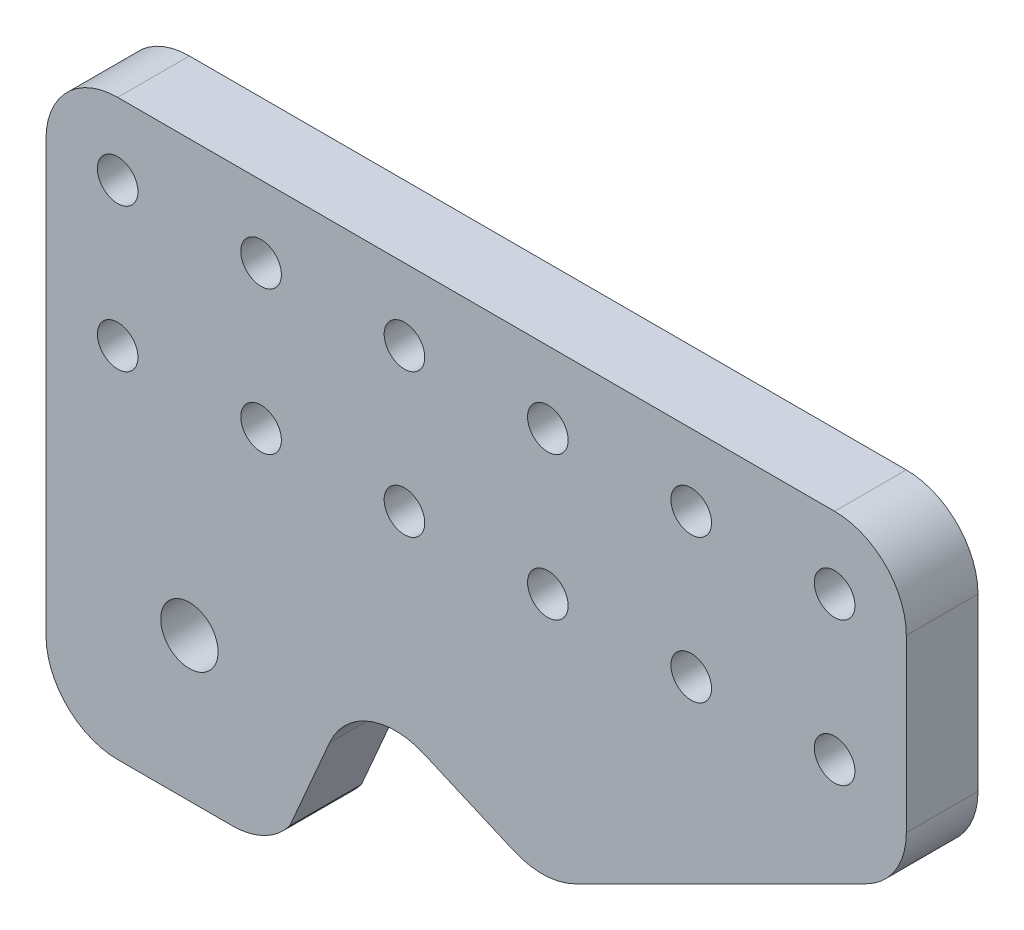
ISO-10303-21;
HEADER;
FILE_DESCRIPTION(('STEP AP214'),'2;1');
FILE_NAME('part.step','',(''),(''),'','','');
FILE_SCHEMA(('AUTOMOTIVE_DESIGN { 1 0 10303 214 1 1 1 1 }'));
ENDSEC;
DATA;
#1=APPLICATION_CONTEXT('core data for automotive mechanical design processes');
#2=APPLICATION_PROTOCOL_DEFINITION('international standard','automotive_design',2000,#1);
#3=PRODUCT_CONTEXT('',#1,'mechanical');
#4=PRODUCT('Part','Part','',(#3));
#5=PRODUCT_RELATED_PRODUCT_CATEGORY('part','',(#4));
#6=PRODUCT_DEFINITION_FORMATION('','',#4);
#7=PRODUCT_DEFINITION_CONTEXT('part definition',#1,'design');
#8=PRODUCT_DEFINITION('design','',#6,#7);
#9=PRODUCT_DEFINITION_SHAPE('','',#8);
#10=(LENGTH_UNIT() NAMED_UNIT(*) SI_UNIT(.MILLI.,.METRE.));
#11=(NAMED_UNIT(*) PLANE_ANGLE_UNIT() SI_UNIT($,.RADIAN.));
#12=(NAMED_UNIT(*) SI_UNIT($,.STERADIAN.) SOLID_ANGLE_UNIT());
#13=UNCERTAINTY_MEASURE_WITH_UNIT(LENGTH_MEASURE(1.E-05),#10,'distance_accuracy_value','');
#14=(GEOMETRIC_REPRESENTATION_CONTEXT(3) GLOBAL_UNCERTAINTY_ASSIGNED_CONTEXT((#13)) GLOBAL_UNIT_ASSIGNED_CONTEXT((#10,
#11,#12)) REPRESENTATION_CONTEXT('',''));
#15=CARTESIAN_POINT('',(0.,0.,0.));
#16=DIRECTION('',(0.,0.,1.));
#17=DIRECTION('',(1.,0.,0.));
#18=AXIS2_PLACEMENT_3D('',#15,#16,#17);
#19=CARTESIAN_POINT('',(0.,0.,6.35));
#20=DIRECTION('',(0.,0.,-1.));
#21=DIRECTION('',(-1.,0.,0.));
#22=AXIS2_PLACEMENT_3D('',#19,#20,#21);
#23=PLANE('',#22);
#24=DIRECTION('',(-0.917512205861482,0.397707621369263,0.));
#25=VECTOR('',#24,1.);
#26=CARTESIAN_POINT('',(27.6510641496676,16.522886017329,6.35));
#27=LINE('',#26,#25);
#28=CARTESIAN_POINT('',(41.4291340909899,10.5506020646838,6.35));
#29=VERTEX_POINT('',#28);
#30=CARTESIAN_POINT('',(33.477266656888,13.9974426216342,6.35));
#31=VERTEX_POINT('',#30);
#32=EDGE_CURVE('E205',#29,#31,#27,.T.);
#33=ORIENTED_EDGE('',*,*,#32,.F.);
#34=CARTESIAN_POINT('',(43.9545774866847,16.3768045719042,6.35));
#35=DIRECTION('',(0.,0.,-1.));
#36=DIRECTION('',(-1.,0.,0.));
#37=AXIS2_PLACEMENT_3D('',#34,#35,#36);
#38=CIRCLE('',#37,6.35);
#39=CARTESIAN_POINT('',(46.7943838181094,10.6971919090547,6.35));
#40=VERTEX_POINT('',#39);
#41=EDGE_CURVE('E232',#29,#40,#38,.F.);
#42=ORIENTED_EDGE('',*,*,#41,.T.);
#43=DIRECTION('',(0.894427190999916,0.447213595499958,0.));
#44=VECTOR('',#43,1.);
#45=CARTESIAN_POINT('',(25.4,0.,6.35));
#46=LINE('',#45,#44);
#47=CARTESIAN_POINT('',(72.6898063314247,23.6449031657124,6.35));
#48=VERTEX_POINT('',#47);
#49=EDGE_CURVE('E238',#40,#48,#46,.T.);
#50=ORIENTED_EDGE('',*,*,#49,.T.);
#51=CARTESIAN_POINT('',(69.85,29.3245158285619,6.35));
#52=DIRECTION('',(0.,0.,-1.));
#53=DIRECTION('',(-1.,0.,0.));
#54=AXIS2_PLACEMENT_3D('',#51,#52,#53);
#55=CIRCLE('',#54,6.35);
#56=CARTESIAN_POINT('',(76.2,29.3245158285619,6.35));
#57=VERTEX_POINT('',#56);
#58=EDGE_CURVE('E230',#48,#57,#55,.F.);
#59=ORIENTED_EDGE('',*,*,#58,.T.);
#60=DIRECTION('',(0.,1.,0.));
#61=VECTOR('',#60,1.);
#62=CARTESIAN_POINT('',(76.2,25.4,6.35));
#63=LINE('',#62,#61);
#64=CARTESIAN_POINT('',(76.2,44.45,6.35));
#65=VERTEX_POINT('',#64);
#66=EDGE_CURVE('E251',#57,#65,#63,.T.);
#67=ORIENTED_EDGE('',*,*,#66,.T.);
#68=CARTESIAN_POINT('',(69.85,44.45,6.35));
#69=DIRECTION('',(0.,0.,-1.));
#70=DIRECTION('',(-1.,0.,0.));
#71=AXIS2_PLACEMENT_3D('',#68,#69,#70);
#72=CIRCLE('',#71,6.35);
#73=CARTESIAN_POINT('',(69.85,50.8,6.35));
#74=VERTEX_POINT('',#73);
#75=EDGE_CURVE('E228',#65,#74,#72,.F.);
#76=ORIENTED_EDGE('',*,*,#75,.T.);
#77=DIRECTION('',(-1.,0.,0.));
#78=VECTOR('',#77,1.);
#79=CARTESIAN_POINT('',(0.,50.8,6.35));
#80=LINE('',#79,#78);
#81=CARTESIAN_POINT('',(6.35,50.8,6.35));
#82=VERTEX_POINT('',#81);
#83=EDGE_CURVE('E267',#74,#82,#80,.T.);
#84=ORIENTED_EDGE('',*,*,#83,.T.);
#85=CARTESIAN_POINT('',(6.35,44.45,6.35));
#86=DIRECTION('',(0.,0.,-1.));
#87=DIRECTION('',(-1.,0.,0.));
#88=AXIS2_PLACEMENT_3D('',#85,#86,#87);
#89=CIRCLE('',#88,6.35);
#90=CARTESIAN_POINT('',(0.,44.45,6.35));
#91=VERTEX_POINT('',#90);
#92=EDGE_CURVE('E226',#82,#91,#89,.F.);
#93=ORIENTED_EDGE('',*,*,#92,.T.);
#94=DIRECTION('',(0.,-1.,0.));
#95=VECTOR('',#94,1.);
#96=CARTESIAN_POINT('',(0.,50.8,6.35));
#97=LINE('',#96,#95);
#98=CARTESIAN_POINT('',(0.,6.35000000000002,6.35));
#99=VERTEX_POINT('',#98);
#100=EDGE_CURVE('E271',#91,#99,#97,.T.);
#101=ORIENTED_EDGE('',*,*,#100,.T.);
#102=CARTESIAN_POINT('',(6.35,6.35,6.35));
#103=DIRECTION('',(0.,0.,-1.));
#104=DIRECTION('',(-1.,0.,0.));
#105=AXIS2_PLACEMENT_3D('',#102,#103,#104);
#106=CIRCLE('',#105,6.35);
#107=CARTESIAN_POINT('',(6.35,0.,6.35));
#108=VERTEX_POINT('',#107);
#109=EDGE_CURVE('E219',#99,#108,#106,.F.);
#110=ORIENTED_EDGE('',*,*,#109,.T.);
#111=DIRECTION('',(1.,0.,0.));
#112=VECTOR('',#111,1.);
#113=CARTESIAN_POINT('',(0.,0.,6.35));
#114=LINE('',#113,#112);
#115=CARTESIAN_POINT('',(16.51,0.,6.35));
#116=VERTEX_POINT('',#115);
#117=EDGE_CURVE('E244',#108,#116,#114,.T.);
#118=ORIENTED_EDGE('',*,*,#117,.T.);
#119=CARTESIAN_POINT('',(16.51,6.35,6.35));
#120=DIRECTION('',(0.,0.,-1.));
#121=DIRECTION('',(-1.,0.,0.));
#122=AXIS2_PLACEMENT_3D('',#119,#120,#121);
#123=CIRCLE('',#122,6.35);
#124=CARTESIAN_POINT('',(21.59,2.54,6.35));
#125=VERTEX_POINT('',#124);
#126=EDGE_CURVE('E217',#116,#125,#123,.F.);
#127=ORIENTED_EDGE('',*,*,#126,.T.);
#128=DIRECTION('',(-0.397707621369263,-0.917512205861482,0.));
#129=VECTOR('',#128,1.);
#130=CARTESIAN_POINT('',(21.59,2.54,6.35));
#131=LINE('',#130,#129);
#132=CARTESIAN_POINT('',(25.1256207539727,10.6966835101086,6.35));
#133=VERTEX_POINT('',#132);
#134=EDGE_CURVE('E163',#133,#125,#131,.T.);
#135=ORIENTED_EDGE('',*,*,#134,.F.);
#136=CARTESIAN_POINT('',(30.9518232611932,8.17124011441375,6.35));
#137=DIRECTION('',(0.,0.,-1.));
#138=DIRECTION('',(-1.,0.,0.));
#139=AXIS2_PLACEMENT_3D('',#136,#137,#138);
#140=CIRCLE('',#139,6.35);
#141=EDGE_CURVE('E50',#133,#31,#140,.T.);
#142=ORIENTED_EDGE('',*,*,#141,.T.);
#143=EDGE_LOOP('',(#33,#42,#50,#59,#67,#76,#84,#93,#101,#110,#118,#127,#135,#142));
#144=FACE_BOUND('',#143,.T.);
#145=CARTESIAN_POINT('',(12.7,12.7,6.35));
#146=DIRECTION('',(0.,0.,1.));
#147=DIRECTION('',(1.,0.,0.));
#148=AXIS2_PLACEMENT_3D('',#145,#146,#147);
#149=CIRCLE('',#148,2.54);
#150=CARTESIAN_POINT('',(15.24,12.7,6.35));
#151=VERTEX_POINT('',#150);
#152=EDGE_CURVE('E253',#151,#151,#149,.T.);
#153=ORIENTED_EDGE('',*,*,#152,.F.);
#154=EDGE_LOOP('',(#153));
#155=FACE_BOUND('',#154,.T.);
#156=CARTESIAN_POINT('',(69.85,44.45,6.35));
#157=DIRECTION('',(0.,0.,1.));
#158=DIRECTION('',(1.,0.,0.));
#159=AXIS2_PLACEMENT_3D('',#156,#157,#158);
#160=CIRCLE('',#159,1.79773058504601);
#161=CARTESIAN_POINT('',(71.647730585046,44.45,6.35));
#162=VERTEX_POINT('',#161);
#163=EDGE_CURVE('E405',#162,#162,#160,.T.);
#164=ORIENTED_EDGE('',*,*,#163,.F.);
#165=EDGE_LOOP('',(#164));
#166=FACE_BOUND('',#165,.T.);
#167=CARTESIAN_POINT('',(57.15,44.4499999999999,6.35));
#168=DIRECTION('',(0.,0.,1.));
#169=DIRECTION('',(1.,0.,0.));
#170=AXIS2_PLACEMENT_3D('',#167,#168,#169);
#171=CIRCLE('',#170,1.79773058504601);
#172=CARTESIAN_POINT('',(58.947730585046,44.4499999999999,6.35));
#173=VERTEX_POINT('',#172);
#174=EDGE_CURVE('E399',#173,#173,#171,.T.);
#175=ORIENTED_EDGE('',*,*,#174,.F.);
#176=EDGE_LOOP('',(#175));
#177=FACE_BOUND('',#176,.T.);
#178=CARTESIAN_POINT('',(44.45,44.4499999999998,6.35));
#179=DIRECTION('',(0.,0.,1.));
#180=DIRECTION('',(1.,0.,0.));
#181=AXIS2_PLACEMENT_3D('',#178,#179,#180);
#182=CIRCLE('',#181,1.79773058504601);
#183=CARTESIAN_POINT('',(46.247730585046,44.4499999999998,6.35));
#184=VERTEX_POINT('',#183);
#185=EDGE_CURVE('E393',#184,#184,#182,.T.);
#186=ORIENTED_EDGE('',*,*,#185,.F.);
#187=EDGE_LOOP('',(#186));
#188=FACE_BOUND('',#187,.T.);
#189=CARTESIAN_POINT('',(31.75,44.4499999999997,6.35));
#190=DIRECTION('',(0.,0.,1.));
#191=DIRECTION('',(1.,0.,0.));
#192=AXIS2_PLACEMENT_3D('',#189,#190,#191);
#193=CIRCLE('',#192,1.79773058504601);
#194=CARTESIAN_POINT('',(33.5477305850461,44.4499999999997,6.35));
#195=VERTEX_POINT('',#194);
#196=EDGE_CURVE('E387',#195,#195,#193,.T.);
#197=ORIENTED_EDGE('',*,*,#196,.F.);
#198=EDGE_LOOP('',(#197));
#199=FACE_BOUND('',#198,.T.);
#200=CARTESIAN_POINT('',(19.0500000000001,44.4499999999996,6.35));
#201=DIRECTION('',(0.,0.,1.));
#202=DIRECTION('',(1.,0.,0.));
#203=AXIS2_PLACEMENT_3D('',#200,#201,#202);
#204=CIRCLE('',#203,1.797730585046);
#205=CARTESIAN_POINT('',(20.8477305850461,44.4499999999996,6.35));
#206=VERTEX_POINT('',#205);
#207=EDGE_CURVE('E381',#206,#206,#204,.T.);
#208=ORIENTED_EDGE('',*,*,#207,.F.);
#209=EDGE_LOOP('',(#208));
#210=FACE_BOUND('',#209,.T.);
#211=CARTESIAN_POINT('',(6.35000000000006,44.4499999999996,6.35));
#212=DIRECTION('',(0.,0.,1.));
#213=DIRECTION('',(1.,0.,0.));
#214=AXIS2_PLACEMENT_3D('',#211,#212,#213);
#215=CIRCLE('',#214,1.79773058504601);
#216=CARTESIAN_POINT('',(8.14773058504607,44.4499999999996,6.35));
#217=VERTEX_POINT('',#216);
#218=EDGE_CURVE('E375',#217,#217,#215,.T.);
#219=ORIENTED_EDGE('',*,*,#218,.F.);
#220=EDGE_LOOP('',(#219));
#221=FACE_BOUND('',#220,.T.);
#222=CARTESIAN_POINT('',(57.1500000000002,31.7499999999999,6.35));
#223=DIRECTION('',(0.,0.,1.));
#224=DIRECTION('',(1.,0.,0.));
#225=AXIS2_PLACEMENT_3D('',#222,#223,#224);
#226=CIRCLE('',#225,1.79773058504601);
#227=CARTESIAN_POINT('',(58.9477305850462,31.7499999999999,6.35));
#228=VERTEX_POINT('',#227);
#229=EDGE_CURVE('E369',#228,#228,#226,.T.);
#230=ORIENTED_EDGE('',*,*,#229,.F.);
#231=EDGE_LOOP('',(#230));
#232=FACE_BOUND('',#231,.T.);
#233=CARTESIAN_POINT('',(44.4500000000002,31.7499999999998,6.35));
#234=DIRECTION('',(0.,0.,1.));
#235=DIRECTION('',(1.,0.,0.));
#236=AXIS2_PLACEMENT_3D('',#233,#234,#235);
#237=CIRCLE('',#236,1.79773058504601);
#238=CARTESIAN_POINT('',(46.2477305850462,31.7499999999998,6.35));
#239=VERTEX_POINT('',#238);
#240=EDGE_CURVE('E363',#239,#239,#237,.T.);
#241=ORIENTED_EDGE('',*,*,#240,.F.);
#242=EDGE_LOOP('',(#241));
#243=FACE_BOUND('',#242,.T.);
#244=CARTESIAN_POINT('',(31.7500000000002,31.7499999999998,6.35));
#245=DIRECTION('',(0.,0.,1.));
#246=DIRECTION('',(1.,0.,0.));
#247=AXIS2_PLACEMENT_3D('',#244,#245,#246);
#248=CIRCLE('',#247,1.79773058504601);
#249=CARTESIAN_POINT('',(33.5477305850462,31.7499999999998,6.35));
#250=VERTEX_POINT('',#249);
#251=EDGE_CURVE('E357',#250,#250,#248,.T.);
#252=ORIENTED_EDGE('',*,*,#251,.F.);
#253=EDGE_LOOP('',(#252));
#254=FACE_BOUND('',#253,.T.);
#255=CARTESIAN_POINT('',(19.0500000000002,31.7499999999997,6.35));
#256=DIRECTION('',(0.,0.,1.));
#257=DIRECTION('',(1.,0.,0.));
#258=AXIS2_PLACEMENT_3D('',#255,#256,#257);
#259=CIRCLE('',#258,1.79773058504601);
#260=CARTESIAN_POINT('',(20.8477305850462,31.7499999999997,6.35));
#261=VERTEX_POINT('',#260);
#262=EDGE_CURVE('E351',#261,#261,#259,.T.);
#263=ORIENTED_EDGE('',*,*,#262,.F.);
#264=EDGE_LOOP('',(#263));
#265=FACE_BOUND('',#264,.T.);
#266=CARTESIAN_POINT('',(6.3500000000002,31.7499999999996,6.35));
#267=DIRECTION('',(0.,0.,1.));
#268=DIRECTION('',(1.,0.,0.));
#269=AXIS2_PLACEMENT_3D('',#266,#267,#268);
#270=CIRCLE('',#269,1.79773058504601);
#271=CARTESIAN_POINT('',(8.14773058504621,31.7499999999996,6.35));
#272=VERTEX_POINT('',#271);
#273=EDGE_CURVE('E345',#272,#272,#270,.T.);
#274=ORIENTED_EDGE('',*,*,#273,.F.);
#275=EDGE_LOOP('',(#274));
#276=FACE_BOUND('',#275,.T.);
#277=CARTESIAN_POINT('',(69.8500000000002,31.75,6.35));
#278=DIRECTION('',(0.,0.,1.));
#279=DIRECTION('',(1.,0.,0.));
#280=AXIS2_PLACEMENT_3D('',#277,#278,#279);
#281=CIRCLE('',#280,1.79773058504601);
#282=CARTESIAN_POINT('',(71.6477305850462,31.75,6.35));
#283=VERTEX_POINT('',#282);
#284=EDGE_CURVE('E339',#283,#283,#281,.T.);
#285=ORIENTED_EDGE('',*,*,#284,.F.);
#286=EDGE_LOOP('',(#285));
#287=FACE_BOUND('',#286,.T.);
#288=ADVANCED_FACE('F42',(#144,#155,#166,#177,#188,#199,#210,#221,#232,#243,#254,#265,#276,
#287),#23,.F.);
#289=CARTESIAN_POINT('',(0.,0.,0.));
#290=DIRECTION('',(0.,0.,-1.));
#291=DIRECTION('',(-1.,0.,0.));
#292=AXIS2_PLACEMENT_3D('',#289,#290,#291);
#293=PLANE('',#292);
#294=DIRECTION('',(0.894427190999916,0.447213595499958,0.));
#295=VECTOR('',#294,1.);
#296=CARTESIAN_POINT('',(25.4,0.,0.));
#297=LINE('',#296,#295);
#298=CARTESIAN_POINT('',(46.7943838181094,10.6971919090547,0.));
#299=VERTEX_POINT('',#298);
#300=CARTESIAN_POINT('',(72.6898063314247,23.6449031657124,0.));
#301=VERTEX_POINT('',#300);
#302=EDGE_CURVE('E240',#299,#301,#297,.T.);
#303=ORIENTED_EDGE('',*,*,#302,.F.);
#304=CARTESIAN_POINT('',(43.9545774866847,16.3768045719042,0.));
#305=DIRECTION('',(0.,0.,-1.));
#306=DIRECTION('',(-1.,0.,0.));
#307=AXIS2_PLACEMENT_3D('',#304,#305,#306);
#308=CIRCLE('',#307,6.35);
#309=CARTESIAN_POINT('',(41.4291340909899,10.5506020646838,0.));
#310=VERTEX_POINT('',#309);
#311=EDGE_CURVE('E182',#299,#310,#308,.T.);
#312=ORIENTED_EDGE('',*,*,#311,.T.);
#313=DIRECTION('',(-0.917512205861482,0.397707621369263,0.));
#314=VECTOR('',#313,1.);
#315=CARTESIAN_POINT('',(27.6510641496676,16.522886017329,0.));
#316=LINE('',#315,#314);
#317=CARTESIAN_POINT('',(33.477266656888,13.9974426216342,0.));
#318=VERTEX_POINT('',#317);
#319=EDGE_CURVE('E157',#310,#318,#316,.T.);
#320=ORIENTED_EDGE('',*,*,#319,.T.);
#321=CARTESIAN_POINT('',(30.9518232611932,8.17124011441375,0.));
#322=DIRECTION('',(0.,0.,-1.));
#323=DIRECTION('',(-1.,0.,0.));
#324=AXIS2_PLACEMENT_3D('',#321,#322,#323);
#325=CIRCLE('',#324,6.35);
#326=CARTESIAN_POINT('',(25.1256207539727,10.6966835101086,0.));
#327=VERTEX_POINT('',#326);
#328=EDGE_CURVE('E11',#318,#327,#325,.F.);
#329=ORIENTED_EDGE('',*,*,#328,.T.);
#330=DIRECTION('',(-0.397707621369263,-0.917512205861482,0.));
#331=VECTOR('',#330,1.);
#332=CARTESIAN_POINT('',(21.59,2.54,0.));
#333=LINE('',#332,#331);
#334=CARTESIAN_POINT('',(21.59,2.54,0.));
#335=VERTEX_POINT('',#334);
#336=EDGE_CURVE('E142',#327,#335,#333,.T.);
#337=ORIENTED_EDGE('',*,*,#336,.T.);
#338=CARTESIAN_POINT('',(16.51,6.35,0.));
#339=DIRECTION('',(0.,0.,-1.));
#340=DIRECTION('',(-1.,0.,0.));
#341=AXIS2_PLACEMENT_3D('',#338,#339,#340);
#342=CIRCLE('',#341,6.35);
#343=CARTESIAN_POINT('',(16.51,0.,0.));
#344=VERTEX_POINT('',#343);
#345=EDGE_CURVE('E149',#335,#344,#342,.T.);
#346=ORIENTED_EDGE('',*,*,#345,.T.);
#347=DIRECTION('',(1.,0.,0.));
#348=VECTOR('',#347,1.);
#349=CARTESIAN_POINT('',(0.,0.,0.));
#350=LINE('',#349,#348);
#351=CARTESIAN_POINT('',(6.35,0.,0.));
#352=VERTEX_POINT('',#351);
#353=EDGE_CURVE('E265',#352,#344,#350,.T.);
#354=ORIENTED_EDGE('',*,*,#353,.F.);
#355=CARTESIAN_POINT('',(6.35,6.35,0.));
#356=DIRECTION('',(0.,0.,-1.));
#357=DIRECTION('',(-1.,0.,0.));
#358=AXIS2_PLACEMENT_3D('',#355,#356,#357);
#359=CIRCLE('',#358,6.35);
#360=CARTESIAN_POINT('',(0.,6.35000000000002,0.));
#361=VERTEX_POINT('',#360);
#362=EDGE_CURVE('E170',#352,#361,#359,.T.);
#363=ORIENTED_EDGE('',*,*,#362,.T.);
#364=DIRECTION('',(0.,-1.,0.));
#365=VECTOR('',#364,1.);
#366=CARTESIAN_POINT('',(0.,50.8,0.));
#367=LINE('',#366,#365);
#368=CARTESIAN_POINT('',(0.,44.45,0.));
#369=VERTEX_POINT('',#368);
#370=EDGE_CURVE('E256',#369,#361,#367,.T.);
#371=ORIENTED_EDGE('',*,*,#370,.F.);
#372=CARTESIAN_POINT('',(6.35,44.45,0.));
#373=DIRECTION('',(0.,0.,-1.));
#374=DIRECTION('',(-1.,0.,0.));
#375=AXIS2_PLACEMENT_3D('',#372,#373,#374);
#376=CIRCLE('',#375,6.35);
#377=CARTESIAN_POINT('',(6.35,50.8,0.));
#378=VERTEX_POINT('',#377);
#379=EDGE_CURVE('E173',#369,#378,#376,.T.);
#380=ORIENTED_EDGE('',*,*,#379,.T.);
#381=DIRECTION('',(-1.,0.,0.));
#382=VECTOR('',#381,1.);
#383=CARTESIAN_POINT('',(0.,50.8,0.));
#384=LINE('',#383,#382);
#385=CARTESIAN_POINT('',(69.85,50.8,0.));
#386=VERTEX_POINT('',#385);
#387=EDGE_CURVE('E252',#386,#378,#384,.T.);
#388=ORIENTED_EDGE('',*,*,#387,.F.);
#389=CARTESIAN_POINT('',(69.85,44.45,0.));
#390=DIRECTION('',(0.,0.,-1.));
#391=DIRECTION('',(-1.,0.,0.));
#392=AXIS2_PLACEMENT_3D('',#389,#390,#391);
#393=CIRCLE('',#392,6.35);
#394=CARTESIAN_POINT('',(76.2,44.45,0.));
#395=VERTEX_POINT('',#394);
#396=EDGE_CURVE('E57',#386,#395,#393,.T.);
#397=ORIENTED_EDGE('',*,*,#396,.T.);
#398=DIRECTION('',(0.,1.,0.));
#399=VECTOR('',#398,1.);
#400=CARTESIAN_POINT('',(76.2,25.4,0.));
#401=LINE('',#400,#399);
#402=CARTESIAN_POINT('',(76.2,29.3245158285619,0.));
#403=VERTEX_POINT('',#402);
#404=EDGE_CURVE('E249',#403,#395,#401,.T.);
#405=ORIENTED_EDGE('',*,*,#404,.F.);
#406=CARTESIAN_POINT('',(69.85,29.3245158285619,0.));
#407=DIRECTION('',(0.,0.,-1.));
#408=DIRECTION('',(-1.,0.,0.));
#409=AXIS2_PLACEMENT_3D('',#406,#407,#408);
#410=CIRCLE('',#409,6.35);
#411=EDGE_CURVE('E65',#403,#301,#410,.T.);
#412=ORIENTED_EDGE('',*,*,#411,.T.);
#413=EDGE_LOOP('',(#303,#312,#320,#329,#337,#346,#354,#363,#371,#380,#388,#397,#405,#412));
#414=FACE_BOUND('',#413,.T.);
#415=CARTESIAN_POINT('',(6.3500000000002,31.7499999999996,0.));
#416=DIRECTION('',(0.,0.,1.));
#417=DIRECTION('',(1.,0.,0.));
#418=AXIS2_PLACEMENT_3D('',#415,#416,#417);
#419=CIRCLE('',#418,1.79773058504601);
#420=CARTESIAN_POINT('',(8.14773058504621,31.7499999999996,0.));
#421=VERTEX_POINT('',#420);
#422=EDGE_CURVE('E342',#421,#421,#419,.T.);
#423=ORIENTED_EDGE('',*,*,#422,.T.);
#424=EDGE_LOOP('',(#423));
#425=FACE_BOUND('',#424,.T.);
#426=CARTESIAN_POINT('',(31.7500000000002,31.7499999999998,0.));
#427=DIRECTION('',(0.,0.,1.));
#428=DIRECTION('',(1.,0.,0.));
#429=AXIS2_PLACEMENT_3D('',#426,#427,#428);
#430=CIRCLE('',#429,1.79773058504601);
#431=CARTESIAN_POINT('',(33.5477305850462,31.7499999999998,0.));
#432=VERTEX_POINT('',#431);
#433=EDGE_CURVE('E354',#432,#432,#430,.T.);
#434=ORIENTED_EDGE('',*,*,#433,.T.);
#435=EDGE_LOOP('',(#434));
#436=FACE_BOUND('',#435,.T.);
#437=CARTESIAN_POINT('',(57.1500000000002,31.7499999999999,0.));
#438=DIRECTION('',(0.,0.,1.));
#439=DIRECTION('',(1.,0.,0.));
#440=AXIS2_PLACEMENT_3D('',#437,#438,#439);
#441=CIRCLE('',#440,1.79773058504601);
#442=CARTESIAN_POINT('',(58.9477305850462,31.7499999999999,0.));
#443=VERTEX_POINT('',#442);
#444=EDGE_CURVE('E366',#443,#443,#441,.T.);
#445=ORIENTED_EDGE('',*,*,#444,.T.);
#446=EDGE_LOOP('',(#445));
#447=FACE_BOUND('',#446,.T.);
#448=CARTESIAN_POINT('',(19.0500000000001,44.4499999999996,0.));
#449=DIRECTION('',(0.,0.,1.));
#450=DIRECTION('',(1.,0.,0.));
#451=AXIS2_PLACEMENT_3D('',#448,#449,#450);
#452=CIRCLE('',#451,1.797730585046);
#453=CARTESIAN_POINT('',(20.8477305850461,44.4499999999996,0.));
#454=VERTEX_POINT('',#453);
#455=EDGE_CURVE('E378',#454,#454,#452,.T.);
#456=ORIENTED_EDGE('',*,*,#455,.T.);
#457=EDGE_LOOP('',(#456));
#458=FACE_BOUND('',#457,.T.);
#459=CARTESIAN_POINT('',(44.45,44.4499999999998,0.));
#460=DIRECTION('',(0.,0.,1.));
#461=DIRECTION('',(1.,0.,0.));
#462=AXIS2_PLACEMENT_3D('',#459,#460,#461);
#463=CIRCLE('',#462,1.79773058504601);
#464=CARTESIAN_POINT('',(46.247730585046,44.4499999999998,0.));
#465=VERTEX_POINT('',#464);
#466=EDGE_CURVE('E390',#465,#465,#463,.T.);
#467=ORIENTED_EDGE('',*,*,#466,.T.);
#468=EDGE_LOOP('',(#467));
#469=FACE_BOUND('',#468,.T.);
#470=CARTESIAN_POINT('',(69.85,44.45,0.));
#471=DIRECTION('',(0.,0.,1.));
#472=DIRECTION('',(1.,0.,0.));
#473=AXIS2_PLACEMENT_3D('',#470,#471,#472);
#474=CIRCLE('',#473,1.79773058504601);
#475=CARTESIAN_POINT('',(71.647730585046,44.45,0.));
#476=VERTEX_POINT('',#475);
#477=EDGE_CURVE('E402',#476,#476,#474,.T.);
#478=ORIENTED_EDGE('',*,*,#477,.T.);
#479=EDGE_LOOP('',(#478));
#480=FACE_BOUND('',#479,.T.);
#481=CARTESIAN_POINT('',(12.7,12.7,0.));
#482=DIRECTION('',(0.,0.,1.));
#483=DIRECTION('',(1.,0.,0.));
#484=AXIS2_PLACEMENT_3D('',#481,#482,#483);
#485=CIRCLE('',#484,2.54);
#486=CARTESIAN_POINT('',(15.24,12.7,0.));
#487=VERTEX_POINT('',#486);
#488=EDGE_CURVE('E259',#487,#487,#485,.T.);
#489=ORIENTED_EDGE('',*,*,#488,.T.);
#490=EDGE_LOOP('',(#489));
#491=FACE_BOUND('',#490,.T.);
#492=CARTESIAN_POINT('',(57.15,44.4499999999999,0.));
#493=DIRECTION('',(0.,0.,1.));
#494=DIRECTION('',(1.,0.,0.));
#495=AXIS2_PLACEMENT_3D('',#492,#493,#494);
#496=CIRCLE('',#495,1.79773058504601);
#497=CARTESIAN_POINT('',(58.947730585046,44.4499999999999,0.));
#498=VERTEX_POINT('',#497);
#499=EDGE_CURVE('E396',#498,#498,#496,.T.);
#500=ORIENTED_EDGE('',*,*,#499,.T.);
#501=EDGE_LOOP('',(#500));
#502=FACE_BOUND('',#501,.T.);
#503=CARTESIAN_POINT('',(31.75,44.4499999999997,0.));
#504=DIRECTION('',(0.,0.,1.));
#505=DIRECTION('',(1.,0.,0.));
#506=AXIS2_PLACEMENT_3D('',#503,#504,#505);
#507=CIRCLE('',#506,1.79773058504601);
#508=CARTESIAN_POINT('',(33.5477305850461,44.4499999999997,0.));
#509=VERTEX_POINT('',#508);
#510=EDGE_CURVE('E384',#509,#509,#507,.T.);
#511=ORIENTED_EDGE('',*,*,#510,.T.);
#512=EDGE_LOOP('',(#511));
#513=FACE_BOUND('',#512,.T.);
#514=CARTESIAN_POINT('',(6.35000000000006,44.4499999999996,0.));
#515=DIRECTION('',(0.,0.,1.));
#516=DIRECTION('',(1.,0.,0.));
#517=AXIS2_PLACEMENT_3D('',#514,#515,#516);
#518=CIRCLE('',#517,1.79773058504601);
#519=CARTESIAN_POINT('',(8.14773058504607,44.4499999999996,0.));
#520=VERTEX_POINT('',#519);
#521=EDGE_CURVE('E372',#520,#520,#518,.T.);
#522=ORIENTED_EDGE('',*,*,#521,.T.);
#523=EDGE_LOOP('',(#522));
#524=FACE_BOUND('',#523,.T.);
#525=CARTESIAN_POINT('',(44.4500000000002,31.7499999999998,0.));
#526=DIRECTION('',(0.,0.,1.));
#527=DIRECTION('',(1.,0.,0.));
#528=AXIS2_PLACEMENT_3D('',#525,#526,#527);
#529=CIRCLE('',#528,1.79773058504601);
#530=CARTESIAN_POINT('',(46.2477305850462,31.7499999999998,0.));
#531=VERTEX_POINT('',#530);
#532=EDGE_CURVE('E360',#531,#531,#529,.T.);
#533=ORIENTED_EDGE('',*,*,#532,.T.);
#534=EDGE_LOOP('',(#533));
#535=FACE_BOUND('',#534,.T.);
#536=CARTESIAN_POINT('',(19.0500000000002,31.7499999999997,0.));
#537=DIRECTION('',(0.,0.,1.));
#538=DIRECTION('',(1.,0.,0.));
#539=AXIS2_PLACEMENT_3D('',#536,#537,#538);
#540=CIRCLE('',#539,1.79773058504601);
#541=CARTESIAN_POINT('',(20.8477305850462,31.7499999999997,0.));
#542=VERTEX_POINT('',#541);
#543=EDGE_CURVE('E348',#542,#542,#540,.T.);
#544=ORIENTED_EDGE('',*,*,#543,.T.);
#545=EDGE_LOOP('',(#544));
#546=FACE_BOUND('',#545,.T.);
#547=CARTESIAN_POINT('',(69.8500000000002,31.75,0.));
#548=DIRECTION('',(0.,0.,1.));
#549=DIRECTION('',(1.,0.,0.));
#550=AXIS2_PLACEMENT_3D('',#547,#548,#549);
#551=CIRCLE('',#550,1.79773058504601);
#552=CARTESIAN_POINT('',(71.6477305850462,31.75,0.));
#553=VERTEX_POINT('',#552);
#554=EDGE_CURVE('E165',#553,#553,#551,.T.);
#555=ORIENTED_EDGE('',*,*,#554,.T.);
#556=EDGE_LOOP('',(#555));
#557=FACE_BOUND('',#556,.T.);
#558=ADVANCED_FACE('F145',(#414,#425,#436,#447,#458,#469,#480,#491,#502,#513,#524,#535,#546,
#557),#293,.T.);
#559=CARTESIAN_POINT('',(76.2,25.4,6.35));
#560=DIRECTION('',(-1.,0.,0.));
#561=DIRECTION('',(0.,0.,1.));
#562=AXIS2_PLACEMENT_3D('',#559,#560,#561);
#563=PLANE('',#562);
#564=ORIENTED_EDGE('',*,*,#66,.F.);
#565=DIRECTION('',(0.,0.,-1.));
#566=VECTOR('',#565,1.);
#567=CARTESIAN_POINT('',(76.2,29.3245158285619,6.35));
#568=LINE('',#567,#566);
#569=EDGE_CURVE('E186',#57,#403,#568,.T.);
#570=ORIENTED_EDGE('',*,*,#569,.T.);
#571=ORIENTED_EDGE('',*,*,#404,.T.);
#572=DIRECTION('',(0.,0.,-1.));
#573=VECTOR('',#572,1.);
#574=CARTESIAN_POINT('',(76.2,44.45,6.35));
#575=LINE('',#574,#573);
#576=EDGE_CURVE('E184',#395,#65,#575,.F.);
#577=ORIENTED_EDGE('',*,*,#576,.T.);
#578=EDGE_LOOP('',(#564,#570,#571,#577));
#579=FACE_BOUND('',#578,.T.);
#580=ADVANCED_FACE('F248',(#579),#563,.F.);
#581=CARTESIAN_POINT('',(0.,50.8,6.35));
#582=DIRECTION('',(0.,-1.,0.));
#583=DIRECTION('',(1.,0.,0.));
#584=AXIS2_PLACEMENT_3D('',#581,#582,#583);
#585=PLANE('',#584);
#586=ORIENTED_EDGE('',*,*,#83,.F.);
#587=DIRECTION('',(0.,0.,-1.));
#588=VECTOR('',#587,1.);
#589=CARTESIAN_POINT('',(69.85,50.8,6.35));
#590=LINE('',#589,#588);
#591=EDGE_CURVE('E190',#74,#386,#590,.T.);
#592=ORIENTED_EDGE('',*,*,#591,.T.);
#593=ORIENTED_EDGE('',*,*,#387,.T.);
#594=DIRECTION('',(0.,0.,-1.));
#595=VECTOR('',#594,1.);
#596=CARTESIAN_POINT('',(6.35,50.8,6.35));
#597=LINE('',#596,#595);
#598=EDGE_CURVE('E188',#378,#82,#597,.F.);
#599=ORIENTED_EDGE('',*,*,#598,.T.);
#600=EDGE_LOOP('',(#586,#592,#593,#599));
#601=FACE_BOUND('',#600,.T.);
#602=ADVANCED_FACE('F296',(#601),#585,.F.);
#603=CARTESIAN_POINT('',(0.,50.8,6.35));
#604=DIRECTION('',(1.,0.,0.));
#605=DIRECTION('',(0.,1.,0.));
#606=AXIS2_PLACEMENT_3D('',#603,#604,#605);
#607=PLANE('',#606);
#608=ORIENTED_EDGE('',*,*,#100,.F.);
#609=DIRECTION('',(0.,0.,-1.));
#610=VECTOR('',#609,1.);
#611=CARTESIAN_POINT('',(0.,44.45,6.35));
#612=LINE('',#611,#610);
#613=EDGE_CURVE('E195',#91,#369,#612,.T.);
#614=ORIENTED_EDGE('',*,*,#613,.T.);
#615=ORIENTED_EDGE('',*,*,#370,.T.);
#616=DIRECTION('',(0.,0.,-1.));
#617=VECTOR('',#616,1.);
#618=CARTESIAN_POINT('',(0.,6.35,6.35));
#619=LINE('',#618,#617);
#620=EDGE_CURVE('E193',#361,#99,#619,.F.);
#621=ORIENTED_EDGE('',*,*,#620,.T.);
#622=EDGE_LOOP('',(#608,#614,#615,#621));
#623=FACE_BOUND('',#622,.T.);
#624=ADVANCED_FACE('F288',(#623),#607,.F.);
#625=CARTESIAN_POINT('',(0.,0.,6.35));
#626=DIRECTION('',(0.,1.,0.));
#627=DIRECTION('',(0.,0.,1.));
#628=AXIS2_PLACEMENT_3D('',#625,#626,#627);
#629=PLANE('',#628);
#630=ORIENTED_EDGE('',*,*,#117,.F.);
#631=DIRECTION('',(0.,0.,-1.));
#632=VECTOR('',#631,1.);
#633=CARTESIAN_POINT('',(6.35,0.,6.35));
#634=LINE('',#633,#632);
#635=EDGE_CURVE('E199',#108,#352,#634,.T.);
#636=ORIENTED_EDGE('',*,*,#635,.T.);
#637=ORIENTED_EDGE('',*,*,#353,.T.);
#638=DIRECTION('',(0.,0.,-1.));
#639=VECTOR('',#638,1.);
#640=CARTESIAN_POINT('',(16.51,0.,6.35));
#641=LINE('',#640,#639);
#642=EDGE_CURVE('E169',#344,#116,#641,.F.);
#643=ORIENTED_EDGE('',*,*,#642,.T.);
#644=EDGE_LOOP('',(#630,#636,#637,#643));
#645=FACE_BOUND('',#644,.T.);
#646=ADVANCED_FACE('F281',(#645),#629,.F.);
#647=CARTESIAN_POINT('',(25.4,0.,6.35));
#648=DIRECTION('',(-0.447213595499958,0.894427190999916,0.));
#649=DIRECTION('',(-0.894427190999916,-0.447213595499958,0.));
#650=AXIS2_PLACEMENT_3D('',#647,#648,#649);
#651=PLANE('',#650);
#652=ORIENTED_EDGE('',*,*,#49,.F.);
#653=DIRECTION('',(0.,0.,1.));
#654=VECTOR('',#653,1.);
#655=CARTESIAN_POINT('',(46.7943838181094,10.6971919090547,6.35));
#656=LINE('',#655,#654);
#657=EDGE_CURVE('E171',#40,#299,#656,.F.);
#658=ORIENTED_EDGE('',*,*,#657,.T.);
#659=ORIENTED_EDGE('',*,*,#302,.T.);
#660=DIRECTION('',(0.,0.,-1.));
#661=VECTOR('',#660,1.);
#662=CARTESIAN_POINT('',(72.6898063314247,23.6449031657124,6.35));
#663=LINE('',#662,#661);
#664=EDGE_CURVE('E175',#301,#48,#663,.F.);
#665=ORIENTED_EDGE('',*,*,#664,.T.);
#666=EDGE_LOOP('',(#652,#658,#659,#665));
#667=FACE_BOUND('',#666,.T.);
#668=ADVANCED_FACE('F237',(#667),#651,.F.);
#669=CARTESIAN_POINT('',(12.7,12.7,6.35));
#670=DIRECTION('',(0.,0.,-1.));
#671=DIRECTION('',(-1.,0.,0.));
#672=AXIS2_PLACEMENT_3D('',#669,#670,#671);
#673=CYLINDRICAL_SURFACE('',#672,2.54);
#674=ORIENTED_EDGE('',*,*,#152,.T.);
#675=EDGE_LOOP('',(#674));
#676=FACE_BOUND('',#675,.T.);
#677=ORIENTED_EDGE('',*,*,#488,.F.);
#678=EDGE_LOOP('',(#677));
#679=FACE_BOUND('',#678,.T.);
#680=ADVANCED_FACE('F316',(#676,#679),#673,.F.);
#681=CARTESIAN_POINT('',(69.85,44.45,6.35));
#682=DIRECTION('',(0.,0.,-1.));
#683=DIRECTION('',(-1.,0.,0.));
#684=AXIS2_PLACEMENT_3D('',#681,#682,#683);
#685=CYLINDRICAL_SURFACE('',#684,1.79773058504601);
#686=ORIENTED_EDGE('',*,*,#163,.T.);
#687=EDGE_LOOP('',(#686));
#688=FACE_BOUND('',#687,.T.);
#689=ORIENTED_EDGE('',*,*,#477,.F.);
#690=EDGE_LOOP('',(#689));
#691=FACE_BOUND('',#690,.T.);
#692=ADVANCED_FACE('F413',(#688,#691),#685,.F.);
#693=CARTESIAN_POINT('',(57.15,44.4499999999999,6.35));
#694=DIRECTION('',(0.,0.,-1.));
#695=DIRECTION('',(-1.,0.,0.));
#696=AXIS2_PLACEMENT_3D('',#693,#694,#695);
#697=CYLINDRICAL_SURFACE('',#696,1.79773058504601);
#698=ORIENTED_EDGE('',*,*,#174,.T.);
#699=EDGE_LOOP('',(#698));
#700=FACE_BOUND('',#699,.T.);
#701=ORIENTED_EDGE('',*,*,#499,.F.);
#702=EDGE_LOOP('',(#701));
#703=FACE_BOUND('',#702,.T.);
#704=ADVANCED_FACE('F415',(#700,#703),#697,.F.);
#705=CARTESIAN_POINT('',(44.45,44.4499999999998,6.35));
#706=DIRECTION('',(0.,0.,-1.));
#707=DIRECTION('',(-1.,0.,0.));
#708=AXIS2_PLACEMENT_3D('',#705,#706,#707);
#709=CYLINDRICAL_SURFACE('',#708,1.79773058504601);
#710=ORIENTED_EDGE('',*,*,#185,.T.);
#711=EDGE_LOOP('',(#710));
#712=FACE_BOUND('',#711,.T.);
#713=ORIENTED_EDGE('',*,*,#466,.F.);
#714=EDGE_LOOP('',(#713));
#715=FACE_BOUND('',#714,.T.);
#716=ADVANCED_FACE('F421',(#712,#715),#709,.F.);
#717=CARTESIAN_POINT('',(31.75,44.4499999999997,6.35));
#718=DIRECTION('',(0.,0.,-1.));
#719=DIRECTION('',(-1.,0.,0.));
#720=AXIS2_PLACEMENT_3D('',#717,#718,#719);
#721=CYLINDRICAL_SURFACE('',#720,1.79773058504601);
#722=ORIENTED_EDGE('',*,*,#196,.T.);
#723=EDGE_LOOP('',(#722));
#724=FACE_BOUND('',#723,.T.);
#725=ORIENTED_EDGE('',*,*,#510,.F.);
#726=EDGE_LOOP('',(#725));
#727=FACE_BOUND('',#726,.T.);
#728=ADVANCED_FACE('F428',(#724,#727),#721,.F.);
#729=CARTESIAN_POINT('',(19.0500000000001,44.4499999999996,6.35));
#730=DIRECTION('',(0.,0.,-1.));
#731=DIRECTION('',(-1.,0.,0.));
#732=AXIS2_PLACEMENT_3D('',#729,#730,#731);
#733=CYLINDRICAL_SURFACE('',#732,1.797730585046);
#734=ORIENTED_EDGE('',*,*,#207,.T.);
#735=EDGE_LOOP('',(#734));
#736=FACE_BOUND('',#735,.T.);
#737=ORIENTED_EDGE('',*,*,#455,.F.);
#738=EDGE_LOOP('',(#737));
#739=FACE_BOUND('',#738,.T.);
#740=ADVANCED_FACE('F432',(#736,#739),#733,.F.);
#741=CARTESIAN_POINT('',(6.35000000000006,44.4499999999996,6.35));
#742=DIRECTION('',(0.,0.,-1.));
#743=DIRECTION('',(-1.,0.,0.));
#744=AXIS2_PLACEMENT_3D('',#741,#742,#743);
#745=CYLINDRICAL_SURFACE('',#744,1.79773058504601);
#746=ORIENTED_EDGE('',*,*,#218,.T.);
#747=EDGE_LOOP('',(#746));
#748=FACE_BOUND('',#747,.T.);
#749=ORIENTED_EDGE('',*,*,#521,.F.);
#750=EDGE_LOOP('',(#749));
#751=FACE_BOUND('',#750,.T.);
#752=ADVANCED_FACE('F436',(#748,#751),#745,.F.);
#753=CARTESIAN_POINT('',(57.1500000000002,31.7499999999999,6.35));
#754=DIRECTION('',(0.,0.,-1.));
#755=DIRECTION('',(-1.,0.,0.));
#756=AXIS2_PLACEMENT_3D('',#753,#754,#755);
#757=CYLINDRICAL_SURFACE('',#756,1.79773058504601);
#758=ORIENTED_EDGE('',*,*,#229,.T.);
#759=EDGE_LOOP('',(#758));
#760=FACE_BOUND('',#759,.T.);
#761=ORIENTED_EDGE('',*,*,#444,.F.);
#762=EDGE_LOOP('',(#761));
#763=FACE_BOUND('',#762,.T.);
#764=ADVANCED_FACE('F440',(#760,#763),#757,.F.);
#765=CARTESIAN_POINT('',(44.4500000000002,31.7499999999998,6.35));
#766=DIRECTION('',(0.,0.,-1.));
#767=DIRECTION('',(-1.,0.,0.));
#768=AXIS2_PLACEMENT_3D('',#765,#766,#767);
#769=CYLINDRICAL_SURFACE('',#768,1.79773058504601);
#770=ORIENTED_EDGE('',*,*,#240,.T.);
#771=EDGE_LOOP('',(#770));
#772=FACE_BOUND('',#771,.T.);
#773=ORIENTED_EDGE('',*,*,#532,.F.);
#774=EDGE_LOOP('',(#773));
#775=FACE_BOUND('',#774,.T.);
#776=ADVANCED_FACE('F444',(#772,#775),#769,.F.);
#777=CARTESIAN_POINT('',(31.7500000000002,31.7499999999998,6.35));
#778=DIRECTION('',(0.,0.,-1.));
#779=DIRECTION('',(-1.,0.,0.));
#780=AXIS2_PLACEMENT_3D('',#777,#778,#779);
#781=CYLINDRICAL_SURFACE('',#780,1.79773058504601);
#782=ORIENTED_EDGE('',*,*,#251,.T.);
#783=EDGE_LOOP('',(#782));
#784=FACE_BOUND('',#783,.T.);
#785=ORIENTED_EDGE('',*,*,#433,.F.);
#786=EDGE_LOOP('',(#785));
#787=FACE_BOUND('',#786,.T.);
#788=ADVANCED_FACE('F448',(#784,#787),#781,.F.);
#789=CARTESIAN_POINT('',(19.0500000000002,31.7499999999997,6.35));
#790=DIRECTION('',(0.,0.,-1.));
#791=DIRECTION('',(-1.,0.,0.));
#792=AXIS2_PLACEMENT_3D('',#789,#790,#791);
#793=CYLINDRICAL_SURFACE('',#792,1.79773058504601);
#794=ORIENTED_EDGE('',*,*,#262,.T.);
#795=EDGE_LOOP('',(#794));
#796=FACE_BOUND('',#795,.T.);
#797=ORIENTED_EDGE('',*,*,#543,.F.);
#798=EDGE_LOOP('',(#797));
#799=FACE_BOUND('',#798,.T.);
#800=ADVANCED_FACE('F452',(#796,#799),#793,.F.);
#801=CARTESIAN_POINT('',(6.3500000000002,31.7499999999996,6.35));
#802=DIRECTION('',(0.,0.,-1.));
#803=DIRECTION('',(-1.,0.,0.));
#804=AXIS2_PLACEMENT_3D('',#801,#802,#803);
#805=CYLINDRICAL_SURFACE('',#804,1.79773058504601);
#806=ORIENTED_EDGE('',*,*,#273,.T.);
#807=EDGE_LOOP('',(#806));
#808=FACE_BOUND('',#807,.T.);
#809=ORIENTED_EDGE('',*,*,#422,.F.);
#810=EDGE_LOOP('',(#809));
#811=FACE_BOUND('',#810,.T.);
#812=ADVANCED_FACE('F456',(#808,#811),#805,.F.);
#813=CARTESIAN_POINT('',(69.8500000000002,31.75,6.35));
#814=DIRECTION('',(0.,0.,-1.));
#815=DIRECTION('',(-1.,0.,0.));
#816=AXIS2_PLACEMENT_3D('',#813,#814,#815);
#817=CYLINDRICAL_SURFACE('',#816,1.79773058504601);
#818=ORIENTED_EDGE('',*,*,#284,.T.);
#819=EDGE_LOOP('',(#818));
#820=FACE_BOUND('',#819,.T.);
#821=ORIENTED_EDGE('',*,*,#554,.F.);
#822=EDGE_LOOP('',(#821));
#823=FACE_BOUND('',#822,.T.);
#824=ADVANCED_FACE('F460',(#820,#823),#817,.F.);
#825=CARTESIAN_POINT('',(21.59,2.54,0.));
#826=DIRECTION('',(-0.917512205861482,0.397707621369263,0.));
#827=DIRECTION('',(-0.397707621369263,-0.917512205861482,0.));
#828=AXIS2_PLACEMENT_3D('',#825,#826,#827);
#829=PLANE('',#828);
#830=ORIENTED_EDGE('',*,*,#336,.F.);
#831=DIRECTION('',(0.,0.,1.));
#832=VECTOR('',#831,1.);
#833=CARTESIAN_POINT('',(25.1256207539727,10.6966835101086,6.35));
#834=LINE('',#833,#832);
#835=EDGE_CURVE('E221',#327,#133,#834,.T.);
#836=ORIENTED_EDGE('',*,*,#835,.T.);
#837=ORIENTED_EDGE('',*,*,#134,.T.);
#838=DIRECTION('',(0.,0.,1.));
#839=VECTOR('',#838,1.);
#840=CARTESIAN_POINT('',(21.59,2.54,0.));
#841=LINE('',#840,#839);
#842=EDGE_CURVE('E156',#335,#125,#841,.T.);
#843=ORIENTED_EDGE('',*,*,#842,.F.);
#844=EDGE_LOOP('',(#830,#836,#837,#843));
#845=FACE_BOUND('',#844,.T.);
#846=ADVANCED_FACE('F161',(#845),#829,.F.);
#847=CARTESIAN_POINT('',(27.6510641496676,16.522886017329,0.));
#848=DIRECTION('',(0.397707621369263,0.917512205861482,0.));
#849=DIRECTION('',(-0.917512205861482,0.397707621369264,0.));
#850=AXIS2_PLACEMENT_3D('',#847,#848,#849);
#851=PLANE('',#850);
#852=ORIENTED_EDGE('',*,*,#32,.T.);
#853=DIRECTION('',(0.,0.,1.));
#854=VECTOR('',#853,1.);
#855=CARTESIAN_POINT('',(33.477266656888,13.9974426216342,0.));
#856=LINE('',#855,#854);
#857=EDGE_CURVE('E212',#31,#318,#856,.F.);
#858=ORIENTED_EDGE('',*,*,#857,.T.);
#859=ORIENTED_EDGE('',*,*,#319,.F.);
#860=DIRECTION('',(0.,0.,1.));
#861=VECTOR('',#860,1.);
#862=CARTESIAN_POINT('',(41.4291340909899,10.5506020646838,0.));
#863=LINE('',#862,#861);
#864=EDGE_CURVE('E214',#310,#29,#863,.T.);
#865=ORIENTED_EDGE('',*,*,#864,.T.);
#866=EDGE_LOOP('',(#852,#858,#859,#865));
#867=FACE_BOUND('',#866,.T.);
#868=ADVANCED_FACE('F210',(#867),#851,.F.);
#869=CARTESIAN_POINT('',(30.9518232611932,8.17124011441375,0.));
#870=DIRECTION('',(0.,0.,-1.));
#871=DIRECTION('',(-1.,0.,0.));
#872=AXIS2_PLACEMENT_3D('',#869,#870,#871);
#873=CYLINDRICAL_SURFACE('',#872,6.35);
#874=ORIENTED_EDGE('',*,*,#328,.F.);
#875=ORIENTED_EDGE('',*,*,#857,.F.);
#876=ORIENTED_EDGE('',*,*,#141,.F.);
#877=ORIENTED_EDGE('',*,*,#835,.F.);
#878=EDGE_LOOP('',(#874,#875,#876,#877));
#879=FACE_BOUND('',#878,.T.);
#880=ADVANCED_FACE('F216',(#879),#873,.F.);
#881=CARTESIAN_POINT('',(43.9545774866847,16.3768045719042,0.));
#882=DIRECTION('',(0.,0.,1.));
#883=DIRECTION('',(1.,0.,0.));
#884=AXIS2_PLACEMENT_3D('',#881,#882,#883);
#885=CYLINDRICAL_SURFACE('',#884,6.35);
#886=ORIENTED_EDGE('',*,*,#311,.F.);
#887=ORIENTED_EDGE('',*,*,#657,.F.);
#888=ORIENTED_EDGE('',*,*,#41,.F.);
#889=ORIENTED_EDGE('',*,*,#864,.F.);
#890=EDGE_LOOP('',(#886,#887,#888,#889));
#891=FACE_BOUND('',#890,.T.);
#892=ADVANCED_FACE('F307',(#891),#885,.T.);
#893=CARTESIAN_POINT('',(69.85,29.3245158285619,6.35));
#894=DIRECTION('',(0.,0.,-1.));
#895=DIRECTION('',(-1.,0.,0.));
#896=AXIS2_PLACEMENT_3D('',#893,#894,#895);
#897=CYLINDRICAL_SURFACE('',#896,6.35);
#898=ORIENTED_EDGE('',*,*,#58,.F.);
#899=ORIENTED_EDGE('',*,*,#664,.F.);
#900=ORIENTED_EDGE('',*,*,#411,.F.);
#901=ORIENTED_EDGE('',*,*,#569,.F.);
#902=EDGE_LOOP('',(#898,#899,#900,#901));
#903=FACE_BOUND('',#902,.T.);
#904=ADVANCED_FACE('F246',(#903),#897,.T.);
#905=CARTESIAN_POINT('',(69.85,44.45,6.35));
#906=DIRECTION('',(0.,0.,-1.));
#907=DIRECTION('',(-1.,0.,0.));
#908=AXIS2_PLACEMENT_3D('',#905,#906,#907);
#909=CYLINDRICAL_SURFACE('',#908,6.35);
#910=ORIENTED_EDGE('',*,*,#75,.F.);
#911=ORIENTED_EDGE('',*,*,#576,.F.);
#912=ORIENTED_EDGE('',*,*,#396,.F.);
#913=ORIENTED_EDGE('',*,*,#591,.F.);
#914=EDGE_LOOP('',(#910,#911,#912,#913));
#915=FACE_BOUND('',#914,.T.);
#916=ADVANCED_FACE('F299',(#915),#909,.T.);
#917=CARTESIAN_POINT('',(6.35,44.45,6.35));
#918=DIRECTION('',(0.,0.,-1.));
#919=DIRECTION('',(-1.,0.,0.));
#920=AXIS2_PLACEMENT_3D('',#917,#918,#919);
#921=CYLINDRICAL_SURFACE('',#920,6.35);
#922=ORIENTED_EDGE('',*,*,#92,.F.);
#923=ORIENTED_EDGE('',*,*,#598,.F.);
#924=ORIENTED_EDGE('',*,*,#379,.F.);
#925=ORIENTED_EDGE('',*,*,#613,.F.);
#926=EDGE_LOOP('',(#922,#923,#924,#925));
#927=FACE_BOUND('',#926,.T.);
#928=ADVANCED_FACE('F292',(#927),#921,.T.);
#929=CARTESIAN_POINT('',(6.35,6.35,6.35));
#930=DIRECTION('',(0.,0.,-1.));
#931=DIRECTION('',(-1.,0.,0.));
#932=AXIS2_PLACEMENT_3D('',#929,#930,#931);
#933=CYLINDRICAL_SURFACE('',#932,6.35);
#934=ORIENTED_EDGE('',*,*,#109,.F.);
#935=ORIENTED_EDGE('',*,*,#620,.F.);
#936=ORIENTED_EDGE('',*,*,#362,.F.);
#937=ORIENTED_EDGE('',*,*,#635,.F.);
#938=EDGE_LOOP('',(#934,#935,#936,#937));
#939=FACE_BOUND('',#938,.T.);
#940=ADVANCED_FACE('F283',(#939),#933,.T.);
#941=CARTESIAN_POINT('',(16.51,6.35,0.));
#942=DIRECTION('',(0.,0.,-1.));
#943=DIRECTION('',(-1.,0.,0.));
#944=AXIS2_PLACEMENT_3D('',#941,#942,#943);
#945=CYLINDRICAL_SURFACE('',#944,6.35);
#946=ORIENTED_EDGE('',*,*,#345,.F.);
#947=ORIENTED_EDGE('',*,*,#842,.T.);
#948=ORIENTED_EDGE('',*,*,#126,.F.);
#949=ORIENTED_EDGE('',*,*,#642,.F.);
#950=EDGE_LOOP('',(#946,#947,#948,#949));
#951=FACE_BOUND('',#950,.T.);
#952=ADVANCED_FACE('F44',(#951),#945,.T.);
#953=CLOSED_SHELL('',(#288,#558,#580,#602,#624,#646,#668,#680,#692,#704,#716,#728,#740,#752,
#764,#776,#788,#800,#812,#824,#846,#868,#880,#892,#904,#916,#928,#940,#952));
#954=MANIFOLD_SOLID_BREP('B2',#953);
#955=ADVANCED_BREP_SHAPE_REPRESENTATION('',(#18,#954),#14);
#956=SHAPE_DEFINITION_REPRESENTATION(#9,#955);
ENDSEC;
END-ISO-10303-21;
